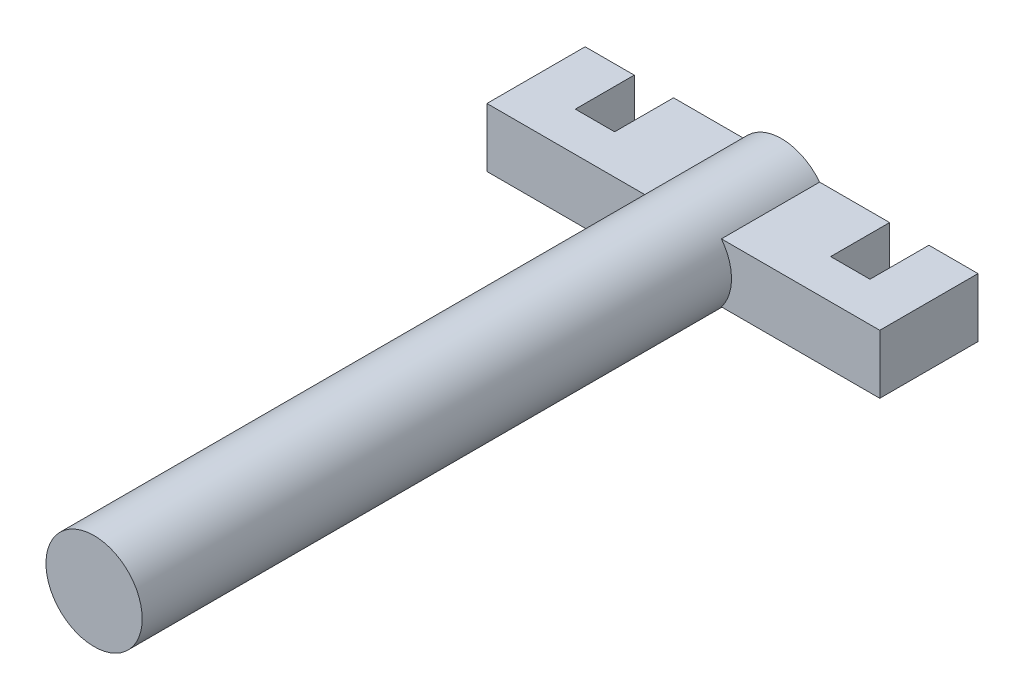
ISO-10303-21;
HEADER;
FILE_DESCRIPTION(('STEP AP214'),'2;1');
FILE_NAME('part.step','',(''),(''),'','','');
FILE_SCHEMA(('AUTOMOTIVE_DESIGN { 1 0 10303 214 1 1 1 1 }'));
ENDSEC;
DATA;
#1=APPLICATION_CONTEXT('core data for automotive mechanical design processes');
#2=APPLICATION_PROTOCOL_DEFINITION('international standard','automotive_design',2000,#1);
#3=PRODUCT_CONTEXT('',#1,'mechanical');
#4=PRODUCT('Part','Part','',(#3));
#5=PRODUCT_RELATED_PRODUCT_CATEGORY('part','',(#4));
#6=PRODUCT_DEFINITION_FORMATION('','',#4);
#7=PRODUCT_DEFINITION_CONTEXT('part definition',#1,'design');
#8=PRODUCT_DEFINITION('design','',#6,#7);
#9=PRODUCT_DEFINITION_SHAPE('','',#8);
#10=(LENGTH_UNIT() NAMED_UNIT(*) SI_UNIT(.MILLI.,.METRE.));
#11=(NAMED_UNIT(*) PLANE_ANGLE_UNIT() SI_UNIT($,.RADIAN.));
#12=(NAMED_UNIT(*) SI_UNIT($,.STERADIAN.) SOLID_ANGLE_UNIT());
#13=UNCERTAINTY_MEASURE_WITH_UNIT(LENGTH_MEASURE(1.E-05),#10,'distance_accuracy_value','');
#14=(GEOMETRIC_REPRESENTATION_CONTEXT(3) GLOBAL_UNCERTAINTY_ASSIGNED_CONTEXT((#13)) GLOBAL_UNIT_ASSIGNED_CONTEXT((#10,
#11,#12)) REPRESENTATION_CONTEXT('',''));
#15=CARTESIAN_POINT('',(0.,0.,0.));
#16=DIRECTION('',(0.,0.,1.));
#17=DIRECTION('',(1.,0.,0.));
#18=AXIS2_PLACEMENT_3D('',#15,#16,#17);
#19=CARTESIAN_POINT('',(0.,0.,0.));
#20=DIRECTION('',(0.,0.,1.));
#21=DIRECTION('',(1.,0.,0.));
#22=AXIS2_PLACEMENT_3D('',#19,#20,#21);
#23=PLANE('',#22);
#24=DIRECTION('',(1.,0.,0.));
#25=VECTOR('',#24,1.);
#26=CARTESIAN_POINT('',(10.,1.5,0.));
#27=LINE('',#26,#25);
#28=CARTESIAN_POINT('',(1.93713706278105,1.5,0.));
#29=VERTEX_POINT('',#28);
#30=CARTESIAN_POINT('',(5.5,1.5,0.));
#31=VERTEX_POINT('',#30);
#32=EDGE_CURVE('E174',#29,#31,#27,.T.);
#33=ORIENTED_EDGE('',*,*,#32,.T.);
#34=DIRECTION('',(0.,1.,0.));
#35=VECTOR('',#34,1.);
#36=CARTESIAN_POINT('',(5.5,1.5,0.));
#37=LINE('',#36,#35);
#38=CARTESIAN_POINT('',(5.5,-1.5,0.));
#39=VERTEX_POINT('',#38);
#40=EDGE_CURVE('E156',#39,#31,#37,.T.);
#41=ORIENTED_EDGE('',*,*,#40,.F.);
#42=DIRECTION('',(-1.,0.,0.));
#43=VECTOR('',#42,1.);
#44=CARTESIAN_POINT('',(10.,-1.5,0.));
#45=LINE('',#44,#43);
#46=CARTESIAN_POINT('',(1.93713706278105,-1.5,0.));
#47=VERTEX_POINT('',#46);
#48=EDGE_CURVE('E222',#39,#47,#45,.T.);
#49=ORIENTED_EDGE('',*,*,#48,.T.);
#50=CARTESIAN_POINT('',(0.,0.,0.));
#51=DIRECTION('',(0.,0.,1.));
#52=DIRECTION('',(1.,0.,0.));
#53=AXIS2_PLACEMENT_3D('',#50,#51,#52);
#54=CIRCLE('',#53,2.45);
#55=CARTESIAN_POINT('',(-1.93713706278105,-1.5,0.));
#56=VERTEX_POINT('',#55);
#57=EDGE_CURVE('E274',#56,#47,#54,.T.);
#58=ORIENTED_EDGE('',*,*,#57,.F.);
#59=CARTESIAN_POINT('',(-5.5,-1.5,0.));
#60=VERTEX_POINT('',#59);
#61=EDGE_CURVE('E224',#56,#60,#45,.T.);
#62=ORIENTED_EDGE('',*,*,#61,.T.);
#63=DIRECTION('',(0.,-1.,0.));
#64=VECTOR('',#63,1.);
#65=CARTESIAN_POINT('',(-5.5,1.5,0.));
#66=LINE('',#65,#64);
#67=CARTESIAN_POINT('',(-5.5,1.5,0.));
#68=VERTEX_POINT('',#67);
#69=EDGE_CURVE('E237',#68,#60,#66,.T.);
#70=ORIENTED_EDGE('',*,*,#69,.F.);
#71=CARTESIAN_POINT('',(-1.93713706278105,1.5,0.));
#72=VERTEX_POINT('',#71);
#73=EDGE_CURVE('E183',#68,#72,#27,.T.);
#74=ORIENTED_EDGE('',*,*,#73,.T.);
#75=EDGE_CURVE('E185',#29,#72,#54,.T.);
#76=ORIENTED_EDGE('',*,*,#75,.F.);
#77=EDGE_LOOP('',(#33,#41,#49,#58,#62,#70,#74,#76));
#78=FACE_BOUND('',#77,.T.);
#79=ADVANCED_FACE('F44',(#78),#23,.F.);
#80=CARTESIAN_POINT('',(-10.,1.5,0.));
#81=VERTEX_POINT('',#80);
#82=CARTESIAN_POINT('',(-7.5,1.5,0.));
#83=VERTEX_POINT('',#82);
#84=EDGE_CURVE('E190',#81,#83,#27,.T.);
#85=ORIENTED_EDGE('',*,*,#84,.T.);
#86=DIRECTION('',(0.,1.,0.));
#87=VECTOR('',#86,1.);
#88=CARTESIAN_POINT('',(-7.5,1.5,0.));
#89=LINE('',#88,#87);
#90=CARTESIAN_POINT('',(-7.5,-1.5,0.));
#91=VERTEX_POINT('',#90);
#92=EDGE_CURVE('E169',#91,#83,#89,.T.);
#93=ORIENTED_EDGE('',*,*,#92,.F.);
#94=CARTESIAN_POINT('',(-10.,-1.5,0.));
#95=VERTEX_POINT('',#94);
#96=EDGE_CURVE('E223',#91,#95,#45,.T.);
#97=ORIENTED_EDGE('',*,*,#96,.T.);
#98=DIRECTION('',(0.,1.,0.));
#99=VECTOR('',#98,1.);
#100=CARTESIAN_POINT('',(-10.,1.5,0.));
#101=LINE('',#100,#99);
#102=EDGE_CURVE('E189',#95,#81,#101,.T.);
#103=ORIENTED_EDGE('',*,*,#102,.T.);
#104=EDGE_LOOP('',(#85,#93,#97,#103));
#105=FACE_BOUND('',#104,.T.);
#106=ADVANCED_FACE('F227',(#105),#23,.F.);
#107=CARTESIAN_POINT('',(0.,0.,35.));
#108=DIRECTION('',(0.,0.,-1.));
#109=DIRECTION('',(-1.,0.,0.));
#110=AXIS2_PLACEMENT_3D('',#107,#108,#109);
#111=CYLINDRICAL_SURFACE('',#110,2.45);
#112=CARTESIAN_POINT('',(0.,0.,5.));
#113=DIRECTION('',(0.,0.,-1.));
#114=DIRECTION('',(-1.,0.,0.));
#115=AXIS2_PLACEMENT_3D('',#112,#113,#114);
#116=CIRCLE('',#115,2.45);
#117=CARTESIAN_POINT('',(1.93713706278105,1.5,5.));
#118=VERTEX_POINT('',#117);
#119=CARTESIAN_POINT('',(1.93713706278105,-1.5,5.));
#120=VERTEX_POINT('',#119);
#121=EDGE_CURVE('E12',#118,#120,#116,.T.);
#122=ORIENTED_EDGE('',*,*,#121,.F.);
#123=DIRECTION('',(0.,0.,-1.));
#124=VECTOR('',#123,1.);
#125=CARTESIAN_POINT('',(1.93713706278105,1.5,35.));
#126=LINE('',#125,#124);
#127=EDGE_CURVE('E275',#118,#29,#126,.T.);
#128=ORIENTED_EDGE('',*,*,#127,.T.);
#129=ORIENTED_EDGE('',*,*,#75,.T.);
#130=DIRECTION('',(0.,0.,-1.));
#131=VECTOR('',#130,1.);
#132=CARTESIAN_POINT('',(-1.93713706278105,1.5,35.));
#133=LINE('',#132,#131);
#134=CARTESIAN_POINT('',(-1.93713706278105,1.5,5.));
#135=VERTEX_POINT('',#134);
#136=EDGE_CURVE('E270',#72,#135,#133,.F.);
#137=ORIENTED_EDGE('',*,*,#136,.T.);
#138=CARTESIAN_POINT('',(-1.93713706278105,-1.5,5.));
#139=VERTEX_POINT('',#138);
#140=EDGE_CURVE('E47',#139,#135,#116,.T.);
#141=ORIENTED_EDGE('',*,*,#140,.F.);
#142=DIRECTION('',(0.,0.,-1.));
#143=VECTOR('',#142,1.);
#144=CARTESIAN_POINT('',(-1.93713706278105,-1.5,35.));
#145=LINE('',#144,#143);
#146=EDGE_CURVE('E283',#139,#56,#145,.T.);
#147=ORIENTED_EDGE('',*,*,#146,.T.);
#148=ORIENTED_EDGE('',*,*,#57,.T.);
#149=DIRECTION('',(0.,0.,-1.));
#150=VECTOR('',#149,1.);
#151=CARTESIAN_POINT('',(1.93713706278105,-1.5,35.));
#152=LINE('',#151,#150);
#153=EDGE_CURVE('E282',#47,#120,#152,.F.);
#154=ORIENTED_EDGE('',*,*,#153,.T.);
#155=EDGE_LOOP('',(#122,#128,#129,#137,#141,#147,#148,#154));
#156=FACE_BOUND('',#155,.T.);
#157=CARTESIAN_POINT('',(0.,0.,35.));
#158=DIRECTION('',(0.,0.,1.));
#159=DIRECTION('',(1.,0.,0.));
#160=AXIS2_PLACEMENT_3D('',#157,#158,#159);
#161=CIRCLE('',#160,2.45);
#162=CARTESIAN_POINT('',(2.45,0.,35.));
#163=VERTEX_POINT('',#162);
#164=EDGE_CURVE('E271',#163,#163,#161,.T.);
#165=ORIENTED_EDGE('',*,*,#164,.F.);
#166=EDGE_LOOP('',(#165));
#167=FACE_BOUND('',#166,.T.);
#168=ADVANCED_FACE('F50',(#156,#167),#111,.T.);
#169=CARTESIAN_POINT('',(0.,0.,35.));
#170=DIRECTION('',(0.,0.,1.));
#171=DIRECTION('',(1.,0.,0.));
#172=AXIS2_PLACEMENT_3D('',#169,#170,#171);
#173=PLANE('',#172);
#174=ORIENTED_EDGE('',*,*,#164,.T.);
#175=EDGE_LOOP('',(#174));
#176=FACE_BOUND('',#175,.T.);
#177=ADVANCED_FACE('F344',(#176),#173,.T.);
#178=CARTESIAN_POINT('',(10.,-1.5,0.));
#179=VERTEX_POINT('',#178);
#180=CARTESIAN_POINT('',(7.5,-1.5,0.));
#181=VERTEX_POINT('',#180);
#182=EDGE_CURVE('E225',#179,#181,#45,.T.);
#183=ORIENTED_EDGE('',*,*,#182,.T.);
#184=DIRECTION('',(0.,-1.,0.));
#185=VECTOR('',#184,1.);
#186=CARTESIAN_POINT('',(7.5,1.5,0.));
#187=LINE('',#186,#185);
#188=CARTESIAN_POINT('',(7.5,1.5,0.));
#189=VERTEX_POINT('',#188);
#190=EDGE_CURVE('E166',#189,#181,#187,.T.);
#191=ORIENTED_EDGE('',*,*,#190,.F.);
#192=CARTESIAN_POINT('',(10.,1.5,0.));
#193=VERTEX_POINT('',#192);
#194=EDGE_CURVE('E184',#189,#193,#27,.T.);
#195=ORIENTED_EDGE('',*,*,#194,.T.);
#196=DIRECTION('',(0.,-1.,0.));
#197=VECTOR('',#196,1.);
#198=CARTESIAN_POINT('',(10.,1.5,0.));
#199=LINE('',#198,#197);
#200=EDGE_CURVE('E216',#193,#179,#199,.T.);
#201=ORIENTED_EDGE('',*,*,#200,.T.);
#202=EDGE_LOOP('',(#183,#191,#195,#201));
#203=FACE_BOUND('',#202,.T.);
#204=ADVANCED_FACE('F300',(#203),#23,.F.);
#205=CARTESIAN_POINT('',(-10.,1.5,5.));
#206=DIRECTION('',(-1.,0.,0.));
#207=DIRECTION('',(0.,0.,1.));
#208=AXIS2_PLACEMENT_3D('',#205,#206,#207);
#209=PLANE('',#208);
#210=ORIENTED_EDGE('',*,*,#102,.F.);
#211=DIRECTION('',(0.,0.,-1.));
#212=VECTOR('',#211,1.);
#213=CARTESIAN_POINT('',(-10.,-1.5,5.));
#214=LINE('',#213,#212);
#215=CARTESIAN_POINT('',(-10.,-1.5,5.));
#216=VERTEX_POINT('',#215);
#217=EDGE_CURVE('E286',#216,#95,#214,.T.);
#218=ORIENTED_EDGE('',*,*,#217,.F.);
#219=DIRECTION('',(0.,1.,0.));
#220=VECTOR('',#219,1.);
#221=CARTESIAN_POINT('',(-10.,1.5,5.));
#222=LINE('',#221,#220);
#223=CARTESIAN_POINT('',(-10.,1.5,5.));
#224=VERTEX_POINT('',#223);
#225=EDGE_CURVE('E208',#216,#224,#222,.T.);
#226=ORIENTED_EDGE('',*,*,#225,.T.);
#227=DIRECTION('',(0.,0.,-1.));
#228=VECTOR('',#227,1.);
#229=CARTESIAN_POINT('',(-10.,1.5,5.));
#230=LINE('',#229,#228);
#231=EDGE_CURVE('E234',#224,#81,#230,.T.);
#232=ORIENTED_EDGE('',*,*,#231,.T.);
#233=EDGE_LOOP('',(#210,#218,#226,#232));
#234=FACE_BOUND('',#233,.T.);
#235=ADVANCED_FACE('F323',(#234),#209,.T.);
#236=CARTESIAN_POINT('',(0.,0.,5.));
#237=DIRECTION('',(0.,0.,-1.));
#238=DIRECTION('',(-1.,0.,0.));
#239=AXIS2_PLACEMENT_3D('',#236,#237,#238);
#240=PLANE('',#239);
#241=DIRECTION('',(-1.,0.,0.));
#242=VECTOR('',#241,1.);
#243=CARTESIAN_POINT('',(10.,-1.5,5.));
#244=LINE('',#243,#242);
#245=EDGE_CURVE('E196',#139,#216,#244,.T.);
#246=ORIENTED_EDGE('',*,*,#245,.F.);
#247=ORIENTED_EDGE('',*,*,#140,.T.);
#248=DIRECTION('',(1.,0.,0.));
#249=VECTOR('',#248,1.);
#250=CARTESIAN_POINT('',(10.,1.5,5.));
#251=LINE('',#250,#249);
#252=EDGE_CURVE('E211',#224,#135,#251,.T.);
#253=ORIENTED_EDGE('',*,*,#252,.F.);
#254=ORIENTED_EDGE('',*,*,#225,.F.);
#255=EDGE_LOOP('',(#246,#247,#253,#254));
#256=FACE_BOUND('',#255,.T.);
#257=ADVANCED_FACE('F324',(#256),#240,.F.);
#258=CARTESIAN_POINT('',(10.,-1.5,5.));
#259=DIRECTION('',(0.,-1.,0.));
#260=DIRECTION('',(0.,0.,-1.));
#261=AXIS2_PLACEMENT_3D('',#258,#259,#260);
#262=PLANE('',#261);
#263=DIRECTION('',(0.,0.,-1.));
#264=VECTOR('',#263,1.);
#265=CARTESIAN_POINT('',(-7.5,-1.5,8.60555127546399));
#266=LINE('',#265,#264);
#267=CARTESIAN_POINT('',(-7.5,-1.5,3.));
#268=VERTEX_POINT('',#267);
#269=EDGE_CURVE('E249',#268,#91,#266,.T.);
#270=ORIENTED_EDGE('',*,*,#269,.F.);
#271=DIRECTION('',(1.,0.,0.));
#272=VECTOR('',#271,1.);
#273=CARTESIAN_POINT('',(-7.5,-1.5,3.));
#274=LINE('',#273,#272);
#275=CARTESIAN_POINT('',(-5.5,-1.5,3.));
#276=VERTEX_POINT('',#275);
#277=EDGE_CURVE('E251',#268,#276,#274,.T.);
#278=ORIENTED_EDGE('',*,*,#277,.T.);
#279=DIRECTION('',(0.,0.,-1.));
#280=VECTOR('',#279,1.);
#281=CARTESIAN_POINT('',(-5.5,-1.5,8.60555127546399));
#282=LINE('',#281,#280);
#283=EDGE_CURVE('E243',#276,#60,#282,.T.);
#284=ORIENTED_EDGE('',*,*,#283,.T.);
#285=ORIENTED_EDGE('',*,*,#61,.F.);
#286=ORIENTED_EDGE('',*,*,#146,.F.);
#287=ORIENTED_EDGE('',*,*,#245,.T.);
#288=ORIENTED_EDGE('',*,*,#217,.T.);
#289=ORIENTED_EDGE('',*,*,#96,.F.);
#290=EDGE_LOOP('',(#270,#278,#284,#285,#286,#287,#288,#289));
#291=FACE_BOUND('',#290,.T.);
#292=ADVANCED_FACE('F316',(#291),#262,.T.);
#293=CARTESIAN_POINT('',(10.,1.5,5.));
#294=DIRECTION('',(0.,1.,0.));
#295=DIRECTION('',(0.,0.,1.));
#296=AXIS2_PLACEMENT_3D('',#293,#294,#295);
#297=PLANE('',#296);
#298=DIRECTION('',(0.,0.,-1.));
#299=VECTOR('',#298,1.);
#300=CARTESIAN_POINT('',(-7.5,1.5,8.60555127546399));
#301=LINE('',#300,#299);
#302=CARTESIAN_POINT('',(-7.5,1.5,3.));
#303=VERTEX_POINT('',#302);
#304=EDGE_CURVE('E58',#303,#83,#301,.T.);
#305=ORIENTED_EDGE('',*,*,#304,.T.);
#306=ORIENTED_EDGE('',*,*,#84,.F.);
#307=ORIENTED_EDGE('',*,*,#231,.F.);
#308=ORIENTED_EDGE('',*,*,#252,.T.);
#309=ORIENTED_EDGE('',*,*,#136,.F.);
#310=ORIENTED_EDGE('',*,*,#73,.F.);
#311=DIRECTION('',(0.,0.,-1.));
#312=VECTOR('',#311,1.);
#313=CARTESIAN_POINT('',(-5.5,1.5,8.60555127546399));
#314=LINE('',#313,#312);
#315=CARTESIAN_POINT('',(-5.5,1.5,3.));
#316=VERTEX_POINT('',#315);
#317=EDGE_CURVE('E239',#316,#68,#314,.T.);
#318=ORIENTED_EDGE('',*,*,#317,.F.);
#319=DIRECTION('',(-1.,0.,0.));
#320=VECTOR('',#319,1.);
#321=CARTESIAN_POINT('',(-7.5,1.5,3.));
#322=LINE('',#321,#320);
#323=EDGE_CURVE('E238',#316,#303,#322,.T.);
#324=ORIENTED_EDGE('',*,*,#323,.T.);
#325=EDGE_LOOP('',(#305,#306,#307,#308,#309,#310,#318,#324));
#326=FACE_BOUND('',#325,.T.);
#327=ADVANCED_FACE('F231',(#326),#297,.T.);
#328=CARTESIAN_POINT('',(10.,1.5,5.));
#329=VERTEX_POINT('',#328);
#330=EDGE_CURVE('E214',#118,#329,#251,.T.);
#331=ORIENTED_EDGE('',*,*,#330,.F.);
#332=ORIENTED_EDGE('',*,*,#121,.T.);
#333=CARTESIAN_POINT('',(10.,-1.5,5.));
#334=VERTEX_POINT('',#333);
#335=EDGE_CURVE('E201',#334,#120,#244,.T.);
#336=ORIENTED_EDGE('',*,*,#335,.F.);
#337=DIRECTION('',(0.,-1.,0.));
#338=VECTOR('',#337,1.);
#339=CARTESIAN_POINT('',(10.,1.5,5.));
#340=LINE('',#339,#338);
#341=EDGE_CURVE('E195',#329,#334,#340,.T.);
#342=ORIENTED_EDGE('',*,*,#341,.F.);
#343=EDGE_LOOP('',(#331,#332,#336,#342));
#344=FACE_BOUND('',#343,.T.);
#345=ADVANCED_FACE('F360',(#344),#240,.F.);
#346=DIRECTION('',(0.,0.,-1.));
#347=VECTOR('',#346,1.);
#348=CARTESIAN_POINT('',(5.5,1.5,8.60555127546399));
#349=LINE('',#348,#347);
#350=CARTESIAN_POINT('',(5.5,1.5,3.));
#351=VERTEX_POINT('',#350);
#352=EDGE_CURVE('E163',#351,#31,#349,.T.);
#353=ORIENTED_EDGE('',*,*,#352,.T.);
#354=ORIENTED_EDGE('',*,*,#32,.F.);
#355=ORIENTED_EDGE('',*,*,#127,.F.);
#356=ORIENTED_EDGE('',*,*,#330,.T.);
#357=DIRECTION('',(0.,0.,-1.));
#358=VECTOR('',#357,1.);
#359=CARTESIAN_POINT('',(10.,1.5,5.));
#360=LINE('',#359,#358);
#361=EDGE_CURVE('E288',#329,#193,#360,.T.);
#362=ORIENTED_EDGE('',*,*,#361,.T.);
#363=ORIENTED_EDGE('',*,*,#194,.F.);
#364=DIRECTION('',(0.,0.,-1.));
#365=VECTOR('',#364,1.);
#366=CARTESIAN_POINT('',(7.5,1.5,8.60555127546399));
#367=LINE('',#366,#365);
#368=CARTESIAN_POINT('',(7.5,1.5,3.));
#369=VERTEX_POINT('',#368);
#370=EDGE_CURVE('E177',#369,#189,#367,.T.);
#371=ORIENTED_EDGE('',*,*,#370,.F.);
#372=DIRECTION('',(-1.,0.,0.));
#373=VECTOR('',#372,1.);
#374=CARTESIAN_POINT('',(7.5,1.5,3.));
#375=LINE('',#374,#373);
#376=EDGE_CURVE('E178',#369,#351,#375,.T.);
#377=ORIENTED_EDGE('',*,*,#376,.T.);
#378=EDGE_LOOP('',(#353,#354,#355,#356,#362,#363,#371,#377));
#379=FACE_BOUND('',#378,.T.);
#380=ADVANCED_FACE('F173',(#379),#297,.T.);
#381=DIRECTION('',(0.,0.,-1.));
#382=VECTOR('',#381,1.);
#383=CARTESIAN_POINT('',(5.5,-1.5,8.60555127546399));
#384=LINE('',#383,#382);
#385=CARTESIAN_POINT('',(5.5,-1.5,3.));
#386=VERTEX_POINT('',#385);
#387=EDGE_CURVE('E165',#386,#39,#384,.T.);
#388=ORIENTED_EDGE('',*,*,#387,.F.);
#389=DIRECTION('',(1.,0.,0.));
#390=VECTOR('',#389,1.);
#391=CARTESIAN_POINT('',(7.5,-1.5,3.));
#392=LINE('',#391,#390);
#393=CARTESIAN_POINT('',(7.5,-1.5,3.));
#394=VERTEX_POINT('',#393);
#395=EDGE_CURVE('E306',#386,#394,#392,.T.);
#396=ORIENTED_EDGE('',*,*,#395,.T.);
#397=DIRECTION('',(0.,0.,-1.));
#398=VECTOR('',#397,1.);
#399=CARTESIAN_POINT('',(7.5,-1.5,8.60555127546399));
#400=LINE('',#399,#398);
#401=EDGE_CURVE('E66',#394,#181,#400,.T.);
#402=ORIENTED_EDGE('',*,*,#401,.T.);
#403=ORIENTED_EDGE('',*,*,#182,.F.);
#404=DIRECTION('',(0.,0.,-1.));
#405=VECTOR('',#404,1.);
#406=CARTESIAN_POINT('',(10.,-1.5,5.));
#407=LINE('',#406,#405);
#408=EDGE_CURVE('E220',#334,#179,#407,.T.);
#409=ORIENTED_EDGE('',*,*,#408,.F.);
#410=ORIENTED_EDGE('',*,*,#335,.T.);
#411=ORIENTED_EDGE('',*,*,#153,.F.);
#412=ORIENTED_EDGE('',*,*,#48,.F.);
#413=EDGE_LOOP('',(#388,#396,#402,#403,#409,#410,#411,#412));
#414=FACE_BOUND('',#413,.T.);
#415=ADVANCED_FACE('F314',(#414),#262,.T.);
#416=CARTESIAN_POINT('',(10.,1.5,5.));
#417=DIRECTION('',(1.,0.,0.));
#418=DIRECTION('',(0.,0.,-1.));
#419=AXIS2_PLACEMENT_3D('',#416,#417,#418);
#420=PLANE('',#419);
#421=ORIENTED_EDGE('',*,*,#200,.F.);
#422=ORIENTED_EDGE('',*,*,#361,.F.);
#423=ORIENTED_EDGE('',*,*,#341,.T.);
#424=ORIENTED_EDGE('',*,*,#408,.T.);
#425=EDGE_LOOP('',(#421,#422,#423,#424));
#426=FACE_BOUND('',#425,.T.);
#427=ADVANCED_FACE('F295',(#426),#420,.T.);
#428=CARTESIAN_POINT('',(5.5,1.5,8.60555127546399));
#429=DIRECTION('',(-1.,0.,0.));
#430=DIRECTION('',(0.,0.,1.));
#431=AXIS2_PLACEMENT_3D('',#428,#429,#430);
#432=PLANE('',#431);
#433=DIRECTION('',(0.,-1.,0.));
#434=VECTOR('',#433,1.);
#435=CARTESIAN_POINT('',(5.5,1.5,3.));
#436=LINE('',#435,#434);
#437=EDGE_CURVE('E304',#351,#386,#436,.T.);
#438=ORIENTED_EDGE('',*,*,#437,.T.);
#439=ORIENTED_EDGE('',*,*,#387,.T.);
#440=ORIENTED_EDGE('',*,*,#40,.T.);
#441=ORIENTED_EDGE('',*,*,#352,.F.);
#442=EDGE_LOOP('',(#438,#439,#440,#441));
#443=FACE_BOUND('',#442,.T.);
#444=ADVANCED_FACE('F159',(#443),#432,.F.);
#445=CARTESIAN_POINT('',(7.5,1.5,8.60555127546399));
#446=DIRECTION('',(1.,0.,0.));
#447=DIRECTION('',(0.,0.,-1.));
#448=AXIS2_PLACEMENT_3D('',#445,#446,#447);
#449=PLANE('',#448);
#450=DIRECTION('',(0.,1.,0.));
#451=VECTOR('',#450,1.);
#452=CARTESIAN_POINT('',(7.5,1.5,3.));
#453=LINE('',#452,#451);
#454=EDGE_CURVE('E303',#394,#369,#453,.T.);
#455=ORIENTED_EDGE('',*,*,#454,.T.);
#456=ORIENTED_EDGE('',*,*,#370,.T.);
#457=ORIENTED_EDGE('',*,*,#190,.T.);
#458=ORIENTED_EDGE('',*,*,#401,.F.);
#459=EDGE_LOOP('',(#455,#456,#457,#458));
#460=FACE_BOUND('',#459,.T.);
#461=ADVANCED_FACE('F311',(#460),#449,.F.);
#462=CARTESIAN_POINT('',(0.,0.,3.));
#463=DIRECTION('',(0.,0.,-1.));
#464=DIRECTION('',(-1.,0.,0.));
#465=AXIS2_PLACEMENT_3D('',#462,#463,#464);
#466=PLANE('',#465);
#467=ORIENTED_EDGE('',*,*,#437,.F.);
#468=ORIENTED_EDGE('',*,*,#376,.F.);
#469=ORIENTED_EDGE('',*,*,#454,.F.);
#470=ORIENTED_EDGE('',*,*,#395,.F.);
#471=EDGE_LOOP('',(#467,#468,#469,#470));
#472=FACE_BOUND('',#471,.T.);
#473=ADVANCED_FACE('F312',(#472),#466,.T.);
#474=CARTESIAN_POINT('',(-7.5,1.5,8.60555127546399));
#475=DIRECTION('',(-1.,0.,0.));
#476=DIRECTION('',(0.,-1.,0.));
#477=AXIS2_PLACEMENT_3D('',#474,#475,#476);
#478=PLANE('',#477);
#479=DIRECTION('',(0.,-1.,0.));
#480=VECTOR('',#479,1.);
#481=CARTESIAN_POINT('',(-7.5,1.5,3.));
#482=LINE('',#481,#480);
#483=EDGE_CURVE('E254',#303,#268,#482,.T.);
#484=ORIENTED_EDGE('',*,*,#483,.T.);
#485=ORIENTED_EDGE('',*,*,#269,.T.);
#486=ORIENTED_EDGE('',*,*,#92,.T.);
#487=ORIENTED_EDGE('',*,*,#304,.F.);
#488=EDGE_LOOP('',(#484,#485,#486,#487));
#489=FACE_BOUND('',#488,.T.);
#490=ADVANCED_FACE('F328',(#489),#478,.F.);
#491=CARTESIAN_POINT('',(-5.5,1.5,8.60555127546399));
#492=DIRECTION('',(1.,0.,0.));
#493=DIRECTION('',(0.,1.,0.));
#494=AXIS2_PLACEMENT_3D('',#491,#492,#493);
#495=PLANE('',#494);
#496=DIRECTION('',(0.,1.,0.));
#497=VECTOR('',#496,1.);
#498=CARTESIAN_POINT('',(-5.5,1.5,3.));
#499=LINE('',#498,#497);
#500=EDGE_CURVE('E207',#276,#316,#499,.T.);
#501=ORIENTED_EDGE('',*,*,#500,.T.);
#502=ORIENTED_EDGE('',*,*,#317,.T.);
#503=ORIENTED_EDGE('',*,*,#69,.T.);
#504=ORIENTED_EDGE('',*,*,#283,.F.);
#505=EDGE_LOOP('',(#501,#502,#503,#504));
#506=FACE_BOUND('',#505,.T.);
#507=ADVANCED_FACE('F263',(#506),#495,.F.);
#508=CARTESIAN_POINT('',(0.,0.,3.));
#509=DIRECTION('',(0.,0.,-1.));
#510=DIRECTION('',(-1.,0.,0.));
#511=AXIS2_PLACEMENT_3D('',#508,#509,#510);
#512=PLANE('',#511);
#513=ORIENTED_EDGE('',*,*,#483,.F.);
#514=ORIENTED_EDGE('',*,*,#323,.F.);
#515=ORIENTED_EDGE('',*,*,#500,.F.);
#516=ORIENTED_EDGE('',*,*,#277,.F.);
#517=EDGE_LOOP('',(#513,#514,#515,#516));
#518=FACE_BOUND('',#517,.T.);
#519=ADVANCED_FACE('F262',(#518),#512,.T.);
#520=CLOSED_SHELL('',(#79,#106,#168,#177,#204,#235,#257,#292,#327,#345,#380,#415,#427,#444,#461,
#473,#490,#507,#519));
#521=MANIFOLD_SOLID_BREP('B2',#520);
#522=ADVANCED_BREP_SHAPE_REPRESENTATION('',(#18,#521),#14);
#523=SHAPE_DEFINITION_REPRESENTATION(#9,#522);
ENDSEC;
END-ISO-10303-21;
